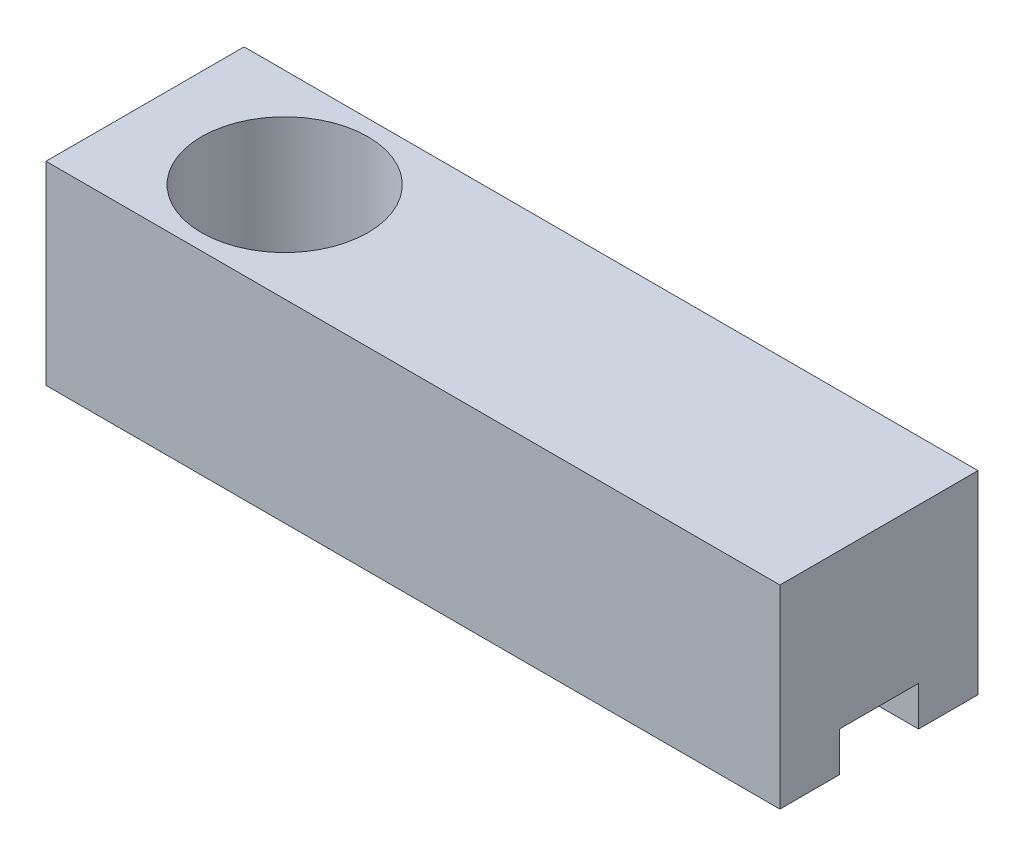
ISO-10303-21;
HEADER;
FILE_DESCRIPTION(('STEP AP214'),'2;1');
FILE_NAME('part.step','',(''),(''),'','','');
FILE_SCHEMA(('AUTOMOTIVE_DESIGN { 1 0 10303 214 1 1 1 1 }'));
ENDSEC;
DATA;
#1=APPLICATION_CONTEXT('core data for automotive mechanical design processes');
#2=APPLICATION_PROTOCOL_DEFINITION('international standard','automotive_design',2000,#1);
#3=PRODUCT_CONTEXT('',#1,'mechanical');
#4=PRODUCT('Part','Part','',(#3));
#5=PRODUCT_RELATED_PRODUCT_CATEGORY('part','',(#4));
#6=PRODUCT_DEFINITION_FORMATION('','',#4);
#7=PRODUCT_DEFINITION_CONTEXT('part definition',#1,'design');
#8=PRODUCT_DEFINITION('design','',#6,#7);
#9=PRODUCT_DEFINITION_SHAPE('','',#8);
#10=(LENGTH_UNIT() NAMED_UNIT(*) SI_UNIT(.MILLI.,.METRE.));
#11=(NAMED_UNIT(*) PLANE_ANGLE_UNIT() SI_UNIT($,.RADIAN.));
#12=(NAMED_UNIT(*) SI_UNIT($,.STERADIAN.) SOLID_ANGLE_UNIT());
#13=UNCERTAINTY_MEASURE_WITH_UNIT(LENGTH_MEASURE(1.E-05),#10,'distance_accuracy_value','');
#14=(GEOMETRIC_REPRESENTATION_CONTEXT(3) GLOBAL_UNCERTAINTY_ASSIGNED_CONTEXT((#13)) GLOBAL_UNIT_ASSIGNED_CONTEXT((#10,
#11,#12)) REPRESENTATION_CONTEXT('',''));
#15=CARTESIAN_POINT('',(0.,0.,0.));
#16=DIRECTION('',(0.,0.,1.));
#17=DIRECTION('',(1.,0.,0.));
#18=AXIS2_PLACEMENT_3D('',#15,#16,#17);
#19=CARTESIAN_POINT('',(0.,0.,0.));
#20=DIRECTION('',(0.,-1.,0.));
#21=DIRECTION('',(0.,0.,-1.));
#22=AXIS2_PLACEMENT_3D('',#19,#20,#21);
#23=PLANE('',#22);
#24=DIRECTION('',(-1.,0.,0.));
#25=VECTOR('',#24,1.);
#26=CARTESIAN_POINT('',(150.,0.,-25.));
#27=LINE('',#26,#25);
#28=CARTESIAN_POINT('',(150.,0.,-25.));
#29=VERTEX_POINT('',#28);
#30=CARTESIAN_POINT('',(-35.2446282149526,0.,-25.));
#31=VERTEX_POINT('',#30);
#32=EDGE_CURVE('E48',#29,#31,#27,.T.);
#33=ORIENTED_EDGE('',*,*,#32,.F.);
#34=DIRECTION('',(0.,0.,-1.));
#35=VECTOR('',#34,1.);
#36=CARTESIAN_POINT('',(150.,0.,35.));
#37=LINE('',#36,#35);
#38=CARTESIAN_POINT('',(150.,0.,-10.));
#39=VERTEX_POINT('',#38);
#40=EDGE_CURVE('E122',#39,#29,#37,.T.);
#41=ORIENTED_EDGE('',*,*,#40,.F.);
#42=DIRECTION('',(1.,0.,0.));
#43=VECTOR('',#42,1.);
#44=CARTESIAN_POINT('',(125.,0.,-10.));
#45=LINE('',#44,#43);
#46=CARTESIAN_POINT('',(125.,0.,-10.));
#47=VERTEX_POINT('',#46);
#48=EDGE_CURVE('E136',#47,#39,#45,.T.);
#49=ORIENTED_EDGE('',*,*,#48,.F.);
#50=DIRECTION('',(0.,0.,-1.));
#51=VECTOR('',#50,1.);
#52=CARTESIAN_POINT('',(125.,0.,10.));
#53=LINE('',#52,#51);
#54=CARTESIAN_POINT('',(125.,0.,10.));
#55=VERTEX_POINT('',#54);
#56=EDGE_CURVE('E315',#55,#47,#53,.T.);
#57=ORIENTED_EDGE('',*,*,#56,.F.);
#58=DIRECTION('',(1.,0.,0.));
#59=VECTOR('',#58,1.);
#60=CARTESIAN_POINT('',(125.,0.,10.));
#61=LINE('',#60,#59);
#62=CARTESIAN_POINT('',(150.,0.,10.));
#63=VERTEX_POINT('',#62);
#64=EDGE_CURVE('E326',#55,#63,#61,.T.);
#65=ORIENTED_EDGE('',*,*,#64,.T.);
#66=CARTESIAN_POINT('',(150.,0.,25.));
#67=VERTEX_POINT('',#66);
#68=EDGE_CURVE('E132',#67,#63,#37,.T.);
#69=ORIENTED_EDGE('',*,*,#68,.F.);
#70=DIRECTION('',(-1.,0.,0.));
#71=VECTOR('',#70,1.);
#72=CARTESIAN_POINT('',(150.,0.,25.));
#73=LINE('',#72,#71);
#74=CARTESIAN_POINT('',(-35.2446282149526,0.,25.));
#75=VERTEX_POINT('',#74);
#76=EDGE_CURVE('E276',#67,#75,#73,.T.);
#77=ORIENTED_EDGE('',*,*,#76,.T.);
#78=DIRECTION('',(0.,0.,-1.));
#79=VECTOR('',#78,1.);
#80=CARTESIAN_POINT('',(-35.2446282149526,0.,-35.));
#81=LINE('',#80,#79);
#82=EDGE_CURVE('E125',#75,#31,#81,.T.);
#83=ORIENTED_EDGE('',*,*,#82,.T.);
#84=EDGE_LOOP('',(#33,#41,#49,#57,#65,#69,#77,#83));
#85=FACE_BOUND('',#84,.T.);
#86=CARTESIAN_POINT('',(0.,0.,0.));
#87=DIRECTION('',(0.,1.,0.));
#88=DIRECTION('',(0.,0.,1.));
#89=AXIS2_PLACEMENT_3D('',#86,#87,#88);
#90=CIRCLE('',#89,21.);
#91=CARTESIAN_POINT('',(0.,0.,21.));
#92=VERTEX_POINT('',#91);
#93=EDGE_CURVE('E41',#92,#92,#90,.T.);
#94=ORIENTED_EDGE('',*,*,#93,.T.);
#95=EDGE_LOOP('',(#94));
#96=FACE_BOUND('',#95,.T.);
#97=ADVANCED_FACE('F34',(#85,#96),#23,.T.);
#98=CARTESIAN_POINT('',(0.,0.,0.));
#99=DIRECTION('',(0.,1.,0.));
#100=DIRECTION('',(0.,0.,1.));
#101=AXIS2_PLACEMENT_3D('',#98,#99,#100);
#102=CYLINDRICAL_SURFACE('',#101,21.);
#103=CARTESIAN_POINT('',(0.,49.,0.));
#104=DIRECTION('',(0.,-1.,0.));
#105=DIRECTION('',(0.,0.,-1.));
#106=AXIS2_PLACEMENT_3D('',#103,#104,#105);
#107=CIRCLE('',#106,21.);
#108=CARTESIAN_POINT('',(0.,49.,-21.));
#109=VERTEX_POINT('',#108);
#110=EDGE_CURVE('E133',#109,#109,#107,.F.);
#111=ORIENTED_EDGE('',*,*,#110,.T.);
#112=EDGE_LOOP('',(#111));
#113=FACE_BOUND('',#112,.T.);
#114=ORIENTED_EDGE('',*,*,#93,.F.);
#115=EDGE_LOOP('',(#114));
#116=FACE_BOUND('',#115,.T.);
#117=ADVANCED_FACE('F142',(#113,#116),#102,.F.);
#118=CARTESIAN_POINT('',(150.,0.,0.));
#119=DIRECTION('',(-1.,0.,0.));
#120=DIRECTION('',(0.,0.,1.));
#121=AXIS2_PLACEMENT_3D('',#118,#119,#120);
#122=PLANE('',#121);
#123=ORIENTED_EDGE('',*,*,#40,.T.);
#124=DIRECTION('',(0.,1.,0.));
#125=VECTOR('',#124,1.);
#126=CARTESIAN_POINT('',(150.,49.,-25.));
#127=LINE('',#126,#125);
#128=CARTESIAN_POINT('',(150.,49.,-25.));
#129=VERTEX_POINT('',#128);
#130=EDGE_CURVE('E108',#29,#129,#127,.T.);
#131=ORIENTED_EDGE('',*,*,#130,.T.);
#132=DIRECTION('',(0.,0.,1.));
#133=VECTOR('',#132,1.);
#134=CARTESIAN_POINT('',(150.,49.,0.));
#135=LINE('',#134,#133);
#136=CARTESIAN_POINT('',(150.,49.,25.));
#137=VERTEX_POINT('',#136);
#138=EDGE_CURVE('E11',#129,#137,#135,.T.);
#139=ORIENTED_EDGE('',*,*,#138,.T.);
#140=DIRECTION('',(0.,-1.,0.));
#141=VECTOR('',#140,1.);
#142=CARTESIAN_POINT('',(150.,49.,25.));
#143=LINE('',#142,#141);
#144=EDGE_CURVE('E280',#137,#67,#143,.T.);
#145=ORIENTED_EDGE('',*,*,#144,.T.);
#146=ORIENTED_EDGE('',*,*,#68,.T.);
#147=DIRECTION('',(0.,-1.,0.));
#148=VECTOR('',#147,1.);
#149=CARTESIAN_POINT('',(150.,0.,10.));
#150=LINE('',#149,#148);
#151=CARTESIAN_POINT('',(150.,10.,10.));
#152=VERTEX_POINT('',#151);
#153=EDGE_CURVE('E312',#152,#63,#150,.T.);
#154=ORIENTED_EDGE('',*,*,#153,.F.);
#155=DIRECTION('',(0.,0.,1.));
#156=VECTOR('',#155,1.);
#157=CARTESIAN_POINT('',(150.,10.,10.));
#158=LINE('',#157,#156);
#159=CARTESIAN_POINT('',(150.,10.,-10.));
#160=VERTEX_POINT('',#159);
#161=EDGE_CURVE('E320',#160,#152,#158,.T.);
#162=ORIENTED_EDGE('',*,*,#161,.F.);
#163=DIRECTION('',(0.,1.,0.));
#164=VECTOR('',#163,1.);
#165=CARTESIAN_POINT('',(150.,0.,-10.));
#166=LINE('',#165,#164);
#167=EDGE_CURVE('E131',#39,#160,#166,.T.);
#168=ORIENTED_EDGE('',*,*,#167,.F.);
#169=EDGE_LOOP('',(#123,#131,#139,#145,#146,#154,#162,#168));
#170=FACE_BOUND('',#169,.T.);
#171=ADVANCED_FACE('F128',(#170),#122,.F.);
#172=CARTESIAN_POINT('',(150.,49.,-50.));
#173=DIRECTION('',(0.,-1.,0.));
#174=DIRECTION('',(0.,0.,-1.));
#175=AXIS2_PLACEMENT_3D('',#172,#173,#174);
#176=PLANE('',#175);
#177=ORIENTED_EDGE('',*,*,#138,.F.);
#178=DIRECTION('',(-1.,0.,0.));
#179=VECTOR('',#178,1.);
#180=CARTESIAN_POINT('',(150.,49.,-25.));
#181=LINE('',#180,#179);
#182=CARTESIAN_POINT('',(-35.2446282149526,49.,-25.));
#183=VERTEX_POINT('',#182);
#184=EDGE_CURVE('E111',#129,#183,#181,.T.);
#185=ORIENTED_EDGE('',*,*,#184,.T.);
#186=DIRECTION('',(0.,0.,-1.));
#187=VECTOR('',#186,1.);
#188=CARTESIAN_POINT('',(-35.2446282149526,49.,-35.));
#189=LINE('',#188,#187);
#190=CARTESIAN_POINT('',(-35.2446282149526,49.,25.));
#191=VERTEX_POINT('',#190);
#192=EDGE_CURVE('E286',#191,#183,#189,.T.);
#193=ORIENTED_EDGE('',*,*,#192,.F.);
#194=DIRECTION('',(-1.,0.,0.));
#195=VECTOR('',#194,1.);
#196=CARTESIAN_POINT('',(150.,49.,25.));
#197=LINE('',#196,#195);
#198=EDGE_CURVE('E56',#137,#191,#197,.T.);
#199=ORIENTED_EDGE('',*,*,#198,.F.);
#200=EDGE_LOOP('',(#177,#185,#193,#199));
#201=FACE_BOUND('',#200,.T.);
#202=ORIENTED_EDGE('',*,*,#110,.F.);
#203=EDGE_LOOP('',(#202));
#204=FACE_BOUND('',#203,.T.);
#205=ADVANCED_FACE('F149',(#201,#204),#176,.F.);
#206=CARTESIAN_POINT('',(125.,0.,-10.));
#207=DIRECTION('',(0.,0.,-1.));
#208=DIRECTION('',(0.,1.,0.));
#209=AXIS2_PLACEMENT_3D('',#206,#207,#208);
#210=PLANE('',#209);
#211=ORIENTED_EDGE('',*,*,#167,.T.);
#212=DIRECTION('',(1.,0.,0.));
#213=VECTOR('',#212,1.);
#214=CARTESIAN_POINT('',(125.,10.,-10.));
#215=LINE('',#214,#213);
#216=CARTESIAN_POINT('',(135.,10.,-10.));
#217=VERTEX_POINT('',#216);
#218=EDGE_CURVE('E318',#217,#160,#215,.T.);
#219=ORIENTED_EDGE('',*,*,#218,.F.);
#220=DIRECTION('',(0.,-1.,0.));
#221=VECTOR('',#220,1.);
#222=CARTESIAN_POINT('',(135.,20.,-9.99999999999999));
#223=LINE('',#222,#221);
#224=CARTESIAN_POINT('',(135.,20.,-9.99999999999999));
#225=VERTEX_POINT('',#224);
#226=EDGE_CURVE('E304',#225,#217,#223,.T.);
#227=ORIENTED_EDGE('',*,*,#226,.F.);
#228=DIRECTION('',(1.,0.,0.));
#229=VECTOR('',#228,1.);
#230=CARTESIAN_POINT('',(125.,20.,-9.99999999999999));
#231=LINE('',#230,#229);
#232=CARTESIAN_POINT('',(125.,20.,-9.99999999999999));
#233=VERTEX_POINT('',#232);
#234=EDGE_CURVE('E296',#233,#225,#231,.T.);
#235=ORIENTED_EDGE('',*,*,#234,.F.);
#236=DIRECTION('',(0.,1.,0.));
#237=VECTOR('',#236,1.);
#238=CARTESIAN_POINT('',(125.,0.,-10.));
#239=LINE('',#238,#237);
#240=EDGE_CURVE('E309',#47,#233,#239,.T.);
#241=ORIENTED_EDGE('',*,*,#240,.F.);
#242=ORIENTED_EDGE('',*,*,#48,.T.);
#243=EDGE_LOOP('',(#211,#219,#227,#235,#241,#242));
#244=FACE_BOUND('',#243,.T.);
#245=ADVANCED_FACE('F154',(#244),#210,.F.);
#246=CARTESIAN_POINT('',(125.,0.,10.));
#247=DIRECTION('',(0.,0.,1.));
#248=DIRECTION('',(1.,0.,0.));
#249=AXIS2_PLACEMENT_3D('',#246,#247,#248);
#250=PLANE('',#249);
#251=ORIENTED_EDGE('',*,*,#153,.T.);
#252=ORIENTED_EDGE('',*,*,#64,.F.);
#253=DIRECTION('',(0.,-1.,0.));
#254=VECTOR('',#253,1.);
#255=CARTESIAN_POINT('',(125.,0.,10.));
#256=LINE('',#255,#254);
#257=CARTESIAN_POINT('',(125.,20.,10.));
#258=VERTEX_POINT('',#257);
#259=EDGE_CURVE('E311',#258,#55,#256,.T.);
#260=ORIENTED_EDGE('',*,*,#259,.F.);
#261=DIRECTION('',(-1.,0.,0.));
#262=VECTOR('',#261,1.);
#263=CARTESIAN_POINT('',(125.,20.,10.));
#264=LINE('',#263,#262);
#265=CARTESIAN_POINT('',(135.,20.,10.));
#266=VERTEX_POINT('',#265);
#267=EDGE_CURVE('E302',#266,#258,#264,.T.);
#268=ORIENTED_EDGE('',*,*,#267,.F.);
#269=DIRECTION('',(0.,-1.,0.));
#270=VECTOR('',#269,1.);
#271=CARTESIAN_POINT('',(135.,20.,10.));
#272=LINE('',#271,#270);
#273=CARTESIAN_POINT('',(135.,10.,10.));
#274=VERTEX_POINT('',#273);
#275=EDGE_CURVE('E306',#266,#274,#272,.T.);
#276=ORIENTED_EDGE('',*,*,#275,.T.);
#277=DIRECTION('',(1.,0.,0.));
#278=VECTOR('',#277,1.);
#279=CARTESIAN_POINT('',(125.,10.,10.));
#280=LINE('',#279,#278);
#281=EDGE_CURVE('E328',#274,#152,#280,.T.);
#282=ORIENTED_EDGE('',*,*,#281,.T.);
#283=EDGE_LOOP('',(#251,#252,#260,#268,#276,#282));
#284=FACE_BOUND('',#283,.T.);
#285=ADVANCED_FACE('F158',(#284),#250,.F.);
#286=CARTESIAN_POINT('',(125.,10.,10.));
#287=DIRECTION('',(0.,1.,0.));
#288=DIRECTION('',(0.,0.,1.));
#289=AXIS2_PLACEMENT_3D('',#286,#287,#288);
#290=PLANE('',#289);
#291=ORIENTED_EDGE('',*,*,#281,.F.);
#292=DIRECTION('',(0.,0.,1.));
#293=VECTOR('',#292,1.);
#294=CARTESIAN_POINT('',(135.,10.,10.));
#295=LINE('',#294,#293);
#296=EDGE_CURVE('E285',#217,#274,#295,.T.);
#297=ORIENTED_EDGE('',*,*,#296,.F.);
#298=ORIENTED_EDGE('',*,*,#218,.T.);
#299=ORIENTED_EDGE('',*,*,#161,.T.);
#300=EDGE_LOOP('',(#291,#297,#298,#299));
#301=FACE_BOUND('',#300,.T.);
#302=ADVANCED_FACE('F160',(#301),#290,.F.);
#303=CARTESIAN_POINT('',(125.,0.,0.));
#304=DIRECTION('',(-1.,0.,0.));
#305=DIRECTION('',(0.,0.,1.));
#306=AXIS2_PLACEMENT_3D('',#303,#304,#305);
#307=PLANE('',#306);
#308=ORIENTED_EDGE('',*,*,#240,.T.);
#309=DIRECTION('',(0.,0.,-1.));
#310=VECTOR('',#309,1.);
#311=CARTESIAN_POINT('',(125.,20.,10.));
#312=LINE('',#311,#310);
#313=EDGE_CURVE('E289',#258,#233,#312,.T.);
#314=ORIENTED_EDGE('',*,*,#313,.F.);
#315=ORIENTED_EDGE('',*,*,#259,.T.);
#316=ORIENTED_EDGE('',*,*,#56,.T.);
#317=EDGE_LOOP('',(#308,#314,#315,#316));
#318=FACE_BOUND('',#317,.T.);
#319=ADVANCED_FACE('F163',(#318),#307,.F.);
#320=CARTESIAN_POINT('',(135.,20.,10.));
#321=DIRECTION('',(1.,0.,0.));
#322=DIRECTION('',(0.,0.,-1.));
#323=AXIS2_PLACEMENT_3D('',#320,#321,#322);
#324=PLANE('',#323);
#325=ORIENTED_EDGE('',*,*,#296,.T.);
#326=ORIENTED_EDGE('',*,*,#275,.F.);
#327=DIRECTION('',(0.,0.,1.));
#328=VECTOR('',#327,1.);
#329=CARTESIAN_POINT('',(135.,20.,10.));
#330=LINE('',#329,#328);
#331=EDGE_CURVE('E299',#225,#266,#330,.T.);
#332=ORIENTED_EDGE('',*,*,#331,.F.);
#333=ORIENTED_EDGE('',*,*,#226,.T.);
#334=EDGE_LOOP('',(#325,#326,#332,#333));
#335=FACE_BOUND('',#334,.T.);
#336=ADVANCED_FACE('F170',(#335),#324,.F.);
#337=CARTESIAN_POINT('',(0.,20.,0.));
#338=DIRECTION('',(0.,-1.,0.));
#339=DIRECTION('',(0.,0.,-1.));
#340=AXIS2_PLACEMENT_3D('',#337,#338,#339);
#341=PLANE('',#340);
#342=ORIENTED_EDGE('',*,*,#313,.T.);
#343=ORIENTED_EDGE('',*,*,#234,.T.);
#344=ORIENTED_EDGE('',*,*,#331,.T.);
#345=ORIENTED_EDGE('',*,*,#267,.T.);
#346=EDGE_LOOP('',(#342,#343,#344,#345));
#347=FACE_BOUND('',#346,.T.);
#348=ADVANCED_FACE('F174',(#347),#341,.T.);
#349=CARTESIAN_POINT('',(-35.2446282149526,0.,-35.));
#350=DIRECTION('',(1.,0.,0.));
#351=DIRECTION('',(0.,0.,-1.));
#352=AXIS2_PLACEMENT_3D('',#349,#350,#351);
#353=PLANE('',#352);
#354=ORIENTED_EDGE('',*,*,#192,.T.);
#355=DIRECTION('',(0.,1.,0.));
#356=VECTOR('',#355,1.);
#357=CARTESIAN_POINT('',(-35.2446282149526,49.,-25.));
#358=LINE('',#357,#356);
#359=EDGE_CURVE('E115',#31,#183,#358,.T.);
#360=ORIENTED_EDGE('',*,*,#359,.F.);
#361=ORIENTED_EDGE('',*,*,#82,.F.);
#362=DIRECTION('',(0.,-1.,0.));
#363=VECTOR('',#362,1.);
#364=CARTESIAN_POINT('',(-35.2446282149526,49.,25.));
#365=LINE('',#364,#363);
#366=EDGE_CURVE('E275',#191,#75,#365,.T.);
#367=ORIENTED_EDGE('',*,*,#366,.F.);
#368=EDGE_LOOP('',(#354,#360,#361,#367));
#369=FACE_BOUND('',#368,.T.);
#370=ADVANCED_FACE('F178',(#369),#353,.F.);
#371=CARTESIAN_POINT('',(150.,49.,25.));
#372=DIRECTION('',(0.,0.,-1.));
#373=DIRECTION('',(0.,1.,0.));
#374=AXIS2_PLACEMENT_3D('',#371,#372,#373);
#375=PLANE('',#374);
#376=ORIENTED_EDGE('',*,*,#366,.T.);
#377=ORIENTED_EDGE('',*,*,#76,.F.);
#378=ORIENTED_EDGE('',*,*,#144,.F.);
#379=ORIENTED_EDGE('',*,*,#198,.T.);
#380=EDGE_LOOP('',(#376,#377,#378,#379));
#381=FACE_BOUND('',#380,.T.);
#382=ADVANCED_FACE('F182',(#381),#375,.F.);
#383=CARTESIAN_POINT('',(150.,49.,-25.));
#384=DIRECTION('',(0.,0.,1.));
#385=DIRECTION('',(0.,-1.,0.));
#386=AXIS2_PLACEMENT_3D('',#383,#384,#385);
#387=PLANE('',#386);
#388=ORIENTED_EDGE('',*,*,#359,.T.);
#389=ORIENTED_EDGE('',*,*,#184,.F.);
#390=ORIENTED_EDGE('',*,*,#130,.F.);
#391=ORIENTED_EDGE('',*,*,#32,.T.);
#392=EDGE_LOOP('',(#388,#389,#390,#391));
#393=FACE_BOUND('',#392,.T.);
#394=ADVANCED_FACE('F109',(#393),#387,.F.);
#395=CLOSED_SHELL('',(#97,#117,#171,#205,#245,#285,#302,#319,#336,#348,#370,#382,#394));
#396=MANIFOLD_SOLID_BREP('B2',#395);
#397=ADVANCED_BREP_SHAPE_REPRESENTATION('',(#18,#396),#14);
#398=SHAPE_DEFINITION_REPRESENTATION(#9,#397);
ENDSEC;
END-ISO-10303-21;
